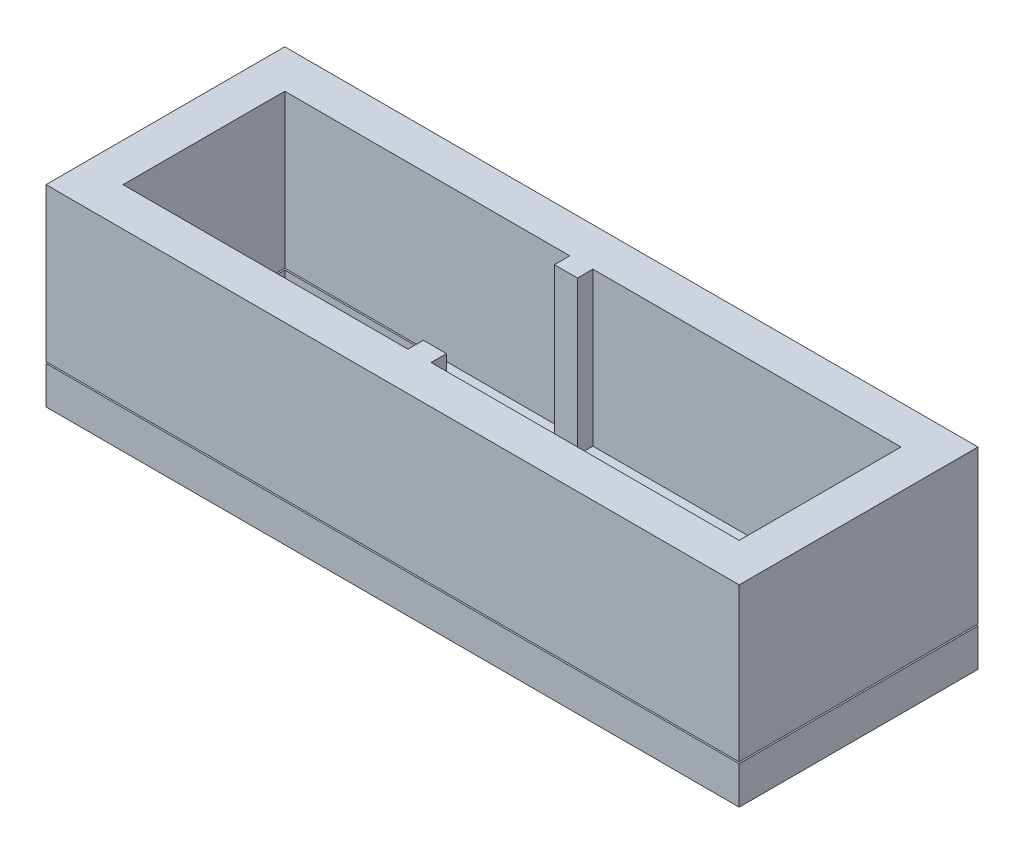
ISO-10303-21;
HEADER;
FILE_DESCRIPTION(('STEP AP214'),'2;1');
FILE_NAME('part.step','',(''),(''),'','','');
FILE_SCHEMA(('AUTOMOTIVE_DESIGN { 1 0 10303 214 1 1 1 1 }'));
ENDSEC;
DATA;
#1=APPLICATION_CONTEXT('core data for automotive mechanical design processes');
#2=APPLICATION_PROTOCOL_DEFINITION('international standard','automotive_design',2000,#1);
#3=PRODUCT_CONTEXT('',#1,'mechanical');
#4=PRODUCT('Part','Part','',(#3));
#5=PRODUCT_RELATED_PRODUCT_CATEGORY('part','',(#4));
#6=PRODUCT_DEFINITION_FORMATION('','',#4);
#7=PRODUCT_DEFINITION_CONTEXT('part definition',#1,'design');
#8=PRODUCT_DEFINITION('design','',#6,#7);
#9=PRODUCT_DEFINITION_SHAPE('','',#8);
#10=(LENGTH_UNIT() NAMED_UNIT(*) SI_UNIT(.MILLI.,.METRE.));
#11=(NAMED_UNIT(*) PLANE_ANGLE_UNIT() SI_UNIT($,.RADIAN.));
#12=(NAMED_UNIT(*) SI_UNIT($,.STERADIAN.) SOLID_ANGLE_UNIT());
#13=UNCERTAINTY_MEASURE_WITH_UNIT(LENGTH_MEASURE(1.E-05),#10,'distance_accuracy_value','');
#14=(GEOMETRIC_REPRESENTATION_CONTEXT(3) GLOBAL_UNCERTAINTY_ASSIGNED_CONTEXT((#13)) GLOBAL_UNIT_ASSIGNED_CONTEXT((#10,
#11,#12)) REPRESENTATION_CONTEXT('',''));
#15=CARTESIAN_POINT('',(0.,0.,0.));
#16=DIRECTION('',(0.,0.,1.));
#17=DIRECTION('',(1.,0.,0.));
#18=AXIS2_PLACEMENT_3D('',#15,#16,#17);
#19=CARTESIAN_POINT('',(-50.8,25.4,-13.335));
#20=DIRECTION('',(0.,0.,1.));
#21=DIRECTION('',(1.,0.,0.));
#22=AXIS2_PLACEMENT_3D('',#19,#20,#21);
#23=PLANE('',#22);
#24=DIRECTION('',(-1.,0.,0.));
#25=VECTOR('',#24,1.);
#26=CARTESIAN_POINT('',(-50.8,0.126999999999999,-13.335));
#27=LINE('',#26,#25);
#28=CARTESIAN_POINT('',(50.8,0.126999999999999,-13.335));
#29=VERTEX_POINT('',#28);
#30=CARTESIAN_POINT('',(0.,0.126999999999999,-13.335));
#31=VERTEX_POINT('',#30);
#32=EDGE_CURVE('E256',#29,#31,#27,.T.);
#33=ORIENTED_EDGE('',*,*,#32,.F.);
#34=DIRECTION('',(0.,-1.,0.));
#35=VECTOR('',#34,1.);
#36=CARTESIAN_POINT('',(50.8,25.4,-13.335));
#37=LINE('',#36,#35);
#38=CARTESIAN_POINT('',(50.8,25.4,-13.335));
#39=VERTEX_POINT('',#38);
#40=EDGE_CURVE('E301',#39,#29,#37,.T.);
#41=ORIENTED_EDGE('',*,*,#40,.F.);
#42=DIRECTION('',(-1.,0.,0.));
#43=VECTOR('',#42,1.);
#44=CARTESIAN_POINT('',(-50.8,25.4,-13.335));
#45=LINE('',#44,#43);
#46=CARTESIAN_POINT('',(0.,25.4,-13.335));
#47=VERTEX_POINT('',#46);
#48=EDGE_CURVE('E230',#39,#47,#45,.T.);
#49=ORIENTED_EDGE('',*,*,#48,.T.);
#50=DIRECTION('',(0.,-1.,0.));
#51=VECTOR('',#50,1.);
#52=CARTESIAN_POINT('',(0.,25.4,-13.335));
#53=LINE('',#52,#51);
#54=EDGE_CURVE('E205',#47,#31,#53,.T.);
#55=ORIENTED_EDGE('',*,*,#54,.T.);
#56=EDGE_LOOP('',(#33,#41,#49,#55));
#57=FACE_BOUND('',#56,.T.);
#58=ADVANCED_FACE('F57',(#57),#23,.T.);
#59=DIRECTION('',(-1.,0.,0.));
#60=VECTOR('',#59,1.);
#61=CARTESIAN_POINT('',(-50.8,0.126999999999999,-13.335));
#62=LINE('',#61,#60);
#63=CARTESIAN_POINT('',(-3.81,0.126999999999999,-13.335));
#64=VERTEX_POINT('',#63);
#65=CARTESIAN_POINT('',(-50.8,0.126999999999999,-13.335));
#66=VERTEX_POINT('',#65);
#67=EDGE_CURVE('E259',#64,#66,#62,.T.);
#68=ORIENTED_EDGE('',*,*,#67,.F.);
#69=DIRECTION('',(0.,-1.,0.));
#70=VECTOR('',#69,1.);
#71=CARTESIAN_POINT('',(-3.81,25.4,-13.335));
#72=LINE('',#71,#70);
#73=CARTESIAN_POINT('',(-3.81,25.4,-13.335));
#74=VERTEX_POINT('',#73);
#75=EDGE_CURVE('E223',#74,#64,#72,.T.);
#76=ORIENTED_EDGE('',*,*,#75,.F.);
#77=CARTESIAN_POINT('',(-50.8,25.4,-13.335));
#78=VERTEX_POINT('',#77);
#79=EDGE_CURVE('E229',#74,#78,#45,.T.);
#80=ORIENTED_EDGE('',*,*,#79,.T.);
#81=DIRECTION('',(0.,-1.,0.));
#82=VECTOR('',#81,1.);
#83=CARTESIAN_POINT('',(-50.8,25.4,-13.335));
#84=LINE('',#83,#82);
#85=EDGE_CURVE('E281',#78,#66,#84,.T.);
#86=ORIENTED_EDGE('',*,*,#85,.T.);
#87=EDGE_LOOP('',(#68,#76,#80,#86));
#88=FACE_BOUND('',#87,.T.);
#89=ADVANCED_FACE('F393',(#88),#23,.T.);
#90=CARTESIAN_POINT('',(-50.8,25.4,13.335));
#91=DIRECTION('',(0.,0.,-1.));
#92=DIRECTION('',(-1.,0.,0.));
#93=AXIS2_PLACEMENT_3D('',#90,#91,#92);
#94=PLANE('',#93);
#95=DIRECTION('',(1.,0.,0.));
#96=VECTOR('',#95,1.);
#97=CARTESIAN_POINT('',(-50.8,0.126999999999999,13.335));
#98=LINE('',#97,#96);
#99=CARTESIAN_POINT('',(0.,0.126999999999999,13.335));
#100=VERTEX_POINT('',#99);
#101=CARTESIAN_POINT('',(50.8,0.126999999999999,13.335));
#102=VERTEX_POINT('',#101);
#103=EDGE_CURVE('E247',#100,#102,#98,.T.);
#104=ORIENTED_EDGE('',*,*,#103,.F.);
#105=DIRECTION('',(0.,-1.,0.));
#106=VECTOR('',#105,1.);
#107=CARTESIAN_POINT('',(0.,25.4,13.335));
#108=LINE('',#107,#106);
#109=CARTESIAN_POINT('',(0.,25.4,13.335));
#110=VERTEX_POINT('',#109);
#111=EDGE_CURVE('E238',#110,#100,#108,.T.);
#112=ORIENTED_EDGE('',*,*,#111,.F.);
#113=DIRECTION('',(1.,0.,0.));
#114=VECTOR('',#113,1.);
#115=CARTESIAN_POINT('',(-50.8,25.4,13.335));
#116=LINE('',#115,#114);
#117=CARTESIAN_POINT('',(50.8,25.4,13.335));
#118=VERTEX_POINT('',#117);
#119=EDGE_CURVE('E284',#110,#118,#116,.T.);
#120=ORIENTED_EDGE('',*,*,#119,.T.);
#121=DIRECTION('',(0.,-1.,0.));
#122=VECTOR('',#121,1.);
#123=CARTESIAN_POINT('',(50.8,25.4,13.335));
#124=LINE('',#123,#122);
#125=EDGE_CURVE('E289',#118,#102,#124,.T.);
#126=ORIENTED_EDGE('',*,*,#125,.T.);
#127=EDGE_LOOP('',(#104,#112,#120,#126));
#128=FACE_BOUND('',#127,.T.);
#129=ADVANCED_FACE('F376',(#128),#94,.T.);
#130=DIRECTION('',(1.,0.,0.));
#131=VECTOR('',#130,1.);
#132=CARTESIAN_POINT('',(-50.8,0.126999999999999,13.335));
#133=LINE('',#132,#131);
#134=CARTESIAN_POINT('',(-50.8,0.126999999999999,13.335));
#135=VERTEX_POINT('',#134);
#136=CARTESIAN_POINT('',(-3.81,0.126999999999999,13.335));
#137=VERTEX_POINT('',#136);
#138=EDGE_CURVE('E67',#135,#137,#133,.T.);
#139=ORIENTED_EDGE('',*,*,#138,.F.);
#140=DIRECTION('',(0.,-1.,0.));
#141=VECTOR('',#140,1.);
#142=CARTESIAN_POINT('',(-50.8,25.4,13.335));
#143=LINE('',#142,#141);
#144=CARTESIAN_POINT('',(-50.8,25.4,13.335));
#145=VERTEX_POINT('',#144);
#146=EDGE_CURVE('E60',#145,#135,#143,.T.);
#147=ORIENTED_EDGE('',*,*,#146,.F.);
#148=CARTESIAN_POINT('',(-3.81,25.4,13.335));
#149=VERTEX_POINT('',#148);
#150=EDGE_CURVE('E291',#145,#149,#116,.T.);
#151=ORIENTED_EDGE('',*,*,#150,.T.);
#152=DIRECTION('',(0.,-1.,0.));
#153=VECTOR('',#152,1.);
#154=CARTESIAN_POINT('',(-3.81,25.4,13.335));
#155=LINE('',#154,#153);
#156=EDGE_CURVE('E318',#149,#137,#155,.T.);
#157=ORIENTED_EDGE('',*,*,#156,.T.);
#158=EDGE_LOOP('',(#139,#147,#151,#157));
#159=FACE_BOUND('',#158,.T.);
#160=ADVANCED_FACE('F364',(#159),#94,.T.);
#161=CARTESIAN_POINT('',(0.,25.4,0.));
#162=DIRECTION('',(0.,-1.,0.));
#163=DIRECTION('',(0.,0.,-1.));
#164=AXIS2_PLACEMENT_3D('',#161,#162,#163);
#165=PLANE('',#164);
#166=DIRECTION('',(0.,0.,-1.));
#167=VECTOR('',#166,1.);
#168=CARTESIAN_POINT('',(57.15,25.4,19.685));
#169=LINE('',#168,#167);
#170=CARTESIAN_POINT('',(57.15,25.4,19.685));
#171=VERTEX_POINT('',#170);
#172=CARTESIAN_POINT('',(57.15,25.4,-19.685));
#173=VERTEX_POINT('',#172);
#174=EDGE_CURVE('E322',#171,#173,#169,.T.);
#175=ORIENTED_EDGE('',*,*,#174,.T.);
#176=DIRECTION('',(-1.,0.,0.));
#177=VECTOR('',#176,1.);
#178=CARTESIAN_POINT('',(-57.15,25.4,-19.685));
#179=LINE('',#178,#177);
#180=CARTESIAN_POINT('',(-57.15,25.4,-19.685));
#181=VERTEX_POINT('',#180);
#182=EDGE_CURVE('E342',#173,#181,#179,.T.);
#183=ORIENTED_EDGE('',*,*,#182,.T.);
#184=DIRECTION('',(0.,0.,1.));
#185=VECTOR('',#184,1.);
#186=CARTESIAN_POINT('',(-57.15,25.4,19.685));
#187=LINE('',#186,#185);
#188=CARTESIAN_POINT('',(-57.15,25.4,19.685));
#189=VERTEX_POINT('',#188);
#190=EDGE_CURVE('E335',#181,#189,#187,.T.);
#191=ORIENTED_EDGE('',*,*,#190,.T.);
#192=DIRECTION('',(1.,0.,0.));
#193=VECTOR('',#192,1.);
#194=CARTESIAN_POINT('',(-57.15,25.4,19.685));
#195=LINE('',#194,#193);
#196=EDGE_CURVE('E332',#189,#171,#195,.T.);
#197=ORIENTED_EDGE('',*,*,#196,.T.);
#198=EDGE_LOOP('',(#175,#183,#191,#197));
#199=FACE_BOUND('',#198,.T.);
#200=DIRECTION('',(0.,0.,-1.));
#201=VECTOR('',#200,1.);
#202=CARTESIAN_POINT('',(50.8,25.4,13.335));
#203=LINE('',#202,#201);
#204=EDGE_CURVE('E233',#118,#39,#203,.T.);
#205=ORIENTED_EDGE('',*,*,#204,.F.);
#206=ORIENTED_EDGE('',*,*,#119,.F.);
#207=DIRECTION('',(0.,0.,-1.));
#208=VECTOR('',#207,1.);
#209=CARTESIAN_POINT('',(0.,25.4,13.335));
#210=LINE('',#209,#208);
#211=CARTESIAN_POINT('',(0.,25.4,10.795));
#212=VERTEX_POINT('',#211);
#213=EDGE_CURVE('E215',#110,#212,#210,.T.);
#214=ORIENTED_EDGE('',*,*,#213,.T.);
#215=DIRECTION('',(-1.,0.,0.));
#216=VECTOR('',#215,1.);
#217=CARTESIAN_POINT('',(0.,25.4,10.795));
#218=LINE('',#217,#216);
#219=CARTESIAN_POINT('',(-3.81,25.4,10.795));
#220=VERTEX_POINT('',#219);
#221=EDGE_CURVE('E328',#212,#220,#218,.T.);
#222=ORIENTED_EDGE('',*,*,#221,.T.);
#223=DIRECTION('',(0.,0.,1.));
#224=VECTOR('',#223,1.);
#225=CARTESIAN_POINT('',(-3.81,25.4,13.335));
#226=LINE('',#225,#224);
#227=EDGE_CURVE('E218',#220,#149,#226,.T.);
#228=ORIENTED_EDGE('',*,*,#227,.T.);
#229=ORIENTED_EDGE('',*,*,#150,.F.);
#230=DIRECTION('',(0.,0.,1.));
#231=VECTOR('',#230,1.);
#232=CARTESIAN_POINT('',(-50.8,25.4,13.335));
#233=LINE('',#232,#231);
#234=EDGE_CURVE('E309',#78,#145,#233,.T.);
#235=ORIENTED_EDGE('',*,*,#234,.F.);
#236=ORIENTED_EDGE('',*,*,#79,.F.);
#237=DIRECTION('',(0.,0.,1.));
#238=VECTOR('',#237,1.);
#239=CARTESIAN_POINT('',(-3.81,25.4,-13.335));
#240=LINE('',#239,#238);
#241=CARTESIAN_POINT('',(-3.81,25.4,-10.795));
#242=VERTEX_POINT('',#241);
#243=EDGE_CURVE('E190',#74,#242,#240,.T.);
#244=ORIENTED_EDGE('',*,*,#243,.T.);
#245=DIRECTION('',(1.,0.,0.));
#246=VECTOR('',#245,1.);
#247=CARTESIAN_POINT('',(0.,25.4,-10.795));
#248=LINE('',#247,#246);
#249=CARTESIAN_POINT('',(0.,25.4,-10.795));
#250=VERTEX_POINT('',#249);
#251=EDGE_CURVE('E181',#242,#250,#248,.T.);
#252=ORIENTED_EDGE('',*,*,#251,.T.);
#253=DIRECTION('',(0.,0.,-1.));
#254=VECTOR('',#253,1.);
#255=CARTESIAN_POINT('',(0.,25.4,-13.335));
#256=LINE('',#255,#254);
#257=EDGE_CURVE('E187',#250,#47,#256,.T.);
#258=ORIENTED_EDGE('',*,*,#257,.T.);
#259=ORIENTED_EDGE('',*,*,#48,.F.);
#260=EDGE_LOOP('',(#205,#206,#214,#222,#228,#229,#235,#236,#244,#252,#258,#259));
#261=FACE_BOUND('',#260,.T.);
#262=ADVANCED_FACE('F184',(#199,#261),#165,.F.);
#263=CARTESIAN_POINT('',(57.15,25.4,19.685));
#264=DIRECTION('',(-1.,0.,0.));
#265=DIRECTION('',(0.,0.,1.));
#266=AXIS2_PLACEMENT_3D('',#263,#264,#265);
#267=PLANE('',#266);
#268=DIRECTION('',(0.,-1.,0.));
#269=VECTOR('',#268,1.);
#270=CARTESIAN_POINT('',(57.15,25.4,19.685));
#271=LINE('',#270,#269);
#272=CARTESIAN_POINT('',(57.15,0.126999999999999,19.685));
#273=VERTEX_POINT('',#272);
#274=EDGE_CURVE('E207',#171,#273,#271,.T.);
#275=ORIENTED_EDGE('',*,*,#274,.T.);
#276=DIRECTION('',(0.,0.,1.));
#277=VECTOR('',#276,1.);
#278=CARTESIAN_POINT('',(57.15,0.127,-19.685));
#279=LINE('',#278,#277);
#280=CARTESIAN_POINT('',(57.15,0.127,-19.685));
#281=VERTEX_POINT('',#280);
#282=EDGE_CURVE('E13',#281,#273,#279,.T.);
#283=ORIENTED_EDGE('',*,*,#282,.F.);
#284=DIRECTION('',(0.,-1.,0.));
#285=VECTOR('',#284,1.);
#286=CARTESIAN_POINT('',(57.15,25.4,-19.685));
#287=LINE('',#286,#285);
#288=EDGE_CURVE('E211',#173,#281,#287,.T.);
#289=ORIENTED_EDGE('',*,*,#288,.F.);
#290=ORIENTED_EDGE('',*,*,#174,.F.);
#291=EDGE_LOOP('',(#275,#283,#289,#290));
#292=FACE_BOUND('',#291,.T.);
#293=ADVANCED_FACE('F420',(#292),#267,.F.);
#294=CARTESIAN_POINT('',(-57.15,25.4,-19.685));
#295=DIRECTION('',(0.,0.,1.));
#296=DIRECTION('',(1.,0.,0.));
#297=AXIS2_PLACEMENT_3D('',#294,#295,#296);
#298=PLANE('',#297);
#299=ORIENTED_EDGE('',*,*,#288,.T.);
#300=DIRECTION('',(-1.,0.,0.));
#301=VECTOR('',#300,1.);
#302=CARTESIAN_POINT('',(0.,0.127,-19.685));
#303=LINE('',#302,#301);
#304=CARTESIAN_POINT('',(-57.15,0.126999999999993,-19.685));
#305=VERTEX_POINT('',#304);
#306=EDGE_CURVE('E84',#281,#305,#303,.T.);
#307=ORIENTED_EDGE('',*,*,#306,.T.);
#308=DIRECTION('',(0.,-1.,0.));
#309=VECTOR('',#308,1.);
#310=CARTESIAN_POINT('',(-57.15,25.4,-19.685));
#311=LINE('',#310,#309);
#312=EDGE_CURVE('E269',#181,#305,#311,.T.);
#313=ORIENTED_EDGE('',*,*,#312,.F.);
#314=ORIENTED_EDGE('',*,*,#182,.F.);
#315=EDGE_LOOP('',(#299,#307,#313,#314));
#316=FACE_BOUND('',#315,.T.);
#317=ADVANCED_FACE('F416',(#316),#298,.F.);
#318=CARTESIAN_POINT('',(-57.15,25.4,19.685));
#319=DIRECTION('',(1.,0.,0.));
#320=DIRECTION('',(0.,0.,-1.));
#321=AXIS2_PLACEMENT_3D('',#318,#319,#320);
#322=PLANE('',#321);
#323=ORIENTED_EDGE('',*,*,#312,.T.);
#324=DIRECTION('',(0.,0.,1.));
#325=VECTOR('',#324,1.);
#326=CARTESIAN_POINT('',(-57.15,0.126999999999993,-19.685));
#327=LINE('',#326,#325);
#328=CARTESIAN_POINT('',(-57.15,0.126999999999993,19.685));
#329=VERTEX_POINT('',#328);
#330=EDGE_CURVE('E87',#305,#329,#327,.T.);
#331=ORIENTED_EDGE('',*,*,#330,.T.);
#332=DIRECTION('',(0.,-1.,0.));
#333=VECTOR('',#332,1.);
#334=CARTESIAN_POINT('',(-57.15,25.4,19.685));
#335=LINE('',#334,#333);
#336=EDGE_CURVE('E234',#189,#329,#335,.T.);
#337=ORIENTED_EDGE('',*,*,#336,.F.);
#338=ORIENTED_EDGE('',*,*,#190,.F.);
#339=EDGE_LOOP('',(#323,#331,#337,#338));
#340=FACE_BOUND('',#339,.T.);
#341=ADVANCED_FACE('F387',(#340),#322,.F.);
#342=CARTESIAN_POINT('',(-57.15,25.4,19.685));
#343=DIRECTION('',(0.,0.,-1.));
#344=DIRECTION('',(-1.,0.,0.));
#345=AXIS2_PLACEMENT_3D('',#342,#343,#344);
#346=PLANE('',#345);
#347=ORIENTED_EDGE('',*,*,#336,.T.);
#348=DIRECTION('',(1.,0.,0.));
#349=VECTOR('',#348,1.);
#350=CARTESIAN_POINT('',(-57.15,0.126999999999999,19.685));
#351=LINE('',#350,#349);
#352=EDGE_CURVE('E75',#329,#273,#351,.T.);
#353=ORIENTED_EDGE('',*,*,#352,.T.);
#354=ORIENTED_EDGE('',*,*,#274,.F.);
#355=ORIENTED_EDGE('',*,*,#196,.F.);
#356=EDGE_LOOP('',(#347,#353,#354,#355));
#357=FACE_BOUND('',#356,.T.);
#358=ADVANCED_FACE('F380',(#357),#346,.F.);
#359=CARTESIAN_POINT('',(50.8,25.4,13.335));
#360=DIRECTION('',(-1.,0.,0.));
#361=DIRECTION('',(0.,0.,1.));
#362=AXIS2_PLACEMENT_3D('',#359,#360,#361);
#363=PLANE('',#362);
#364=DIRECTION('',(0.,0.,-1.));
#365=VECTOR('',#364,1.);
#366=CARTESIAN_POINT('',(50.8,0.126999999999999,13.335));
#367=LINE('',#366,#365);
#368=EDGE_CURVE('E250',#102,#29,#367,.T.);
#369=ORIENTED_EDGE('',*,*,#368,.F.);
#370=ORIENTED_EDGE('',*,*,#125,.F.);
#371=ORIENTED_EDGE('',*,*,#204,.T.);
#372=ORIENTED_EDGE('',*,*,#40,.T.);
#373=EDGE_LOOP('',(#369,#370,#371,#372));
#374=FACE_BOUND('',#373,.T.);
#375=ADVANCED_FACE('F378',(#374),#363,.T.);
#376=CARTESIAN_POINT('',(-50.8,25.4,13.335));
#377=DIRECTION('',(1.,0.,0.));
#378=DIRECTION('',(0.,0.,-1.));
#379=AXIS2_PLACEMENT_3D('',#376,#377,#378);
#380=PLANE('',#379);
#381=DIRECTION('',(0.,0.,1.));
#382=VECTOR('',#381,1.);
#383=CARTESIAN_POINT('',(-50.8,0.126999999999999,13.335));
#384=LINE('',#383,#382);
#385=EDGE_CURVE('E253',#66,#135,#384,.T.);
#386=ORIENTED_EDGE('',*,*,#385,.F.);
#387=ORIENTED_EDGE('',*,*,#85,.F.);
#388=ORIENTED_EDGE('',*,*,#234,.T.);
#389=ORIENTED_EDGE('',*,*,#146,.T.);
#390=EDGE_LOOP('',(#386,#387,#388,#389));
#391=FACE_BOUND('',#390,.T.);
#392=ADVANCED_FACE('F361',(#391),#380,.T.);
#393=CARTESIAN_POINT('',(0.,25.4,13.335));
#394=DIRECTION('',(-1.,0.,0.));
#395=DIRECTION('',(0.,0.,1.));
#396=AXIS2_PLACEMENT_3D('',#393,#394,#395);
#397=PLANE('',#396);
#398=ORIENTED_EDGE('',*,*,#111,.T.);
#399=DIRECTION('',(0.,0.,-1.));
#400=VECTOR('',#399,1.);
#401=CARTESIAN_POINT('',(0.,0.126999999999999,13.335));
#402=LINE('',#401,#400);
#403=CARTESIAN_POINT('',(0.,0.126999999999999,10.795));
#404=VERTEX_POINT('',#403);
#405=EDGE_CURVE('E95',#100,#404,#402,.T.);
#406=ORIENTED_EDGE('',*,*,#405,.T.);
#407=DIRECTION('',(0.,-1.,0.));
#408=VECTOR('',#407,1.);
#409=CARTESIAN_POINT('',(0.,25.4,10.795));
#410=LINE('',#409,#408);
#411=EDGE_CURVE('E237',#212,#404,#410,.T.);
#412=ORIENTED_EDGE('',*,*,#411,.F.);
#413=ORIENTED_EDGE('',*,*,#213,.F.);
#414=EDGE_LOOP('',(#398,#406,#412,#413));
#415=FACE_BOUND('',#414,.T.);
#416=ADVANCED_FACE('F374',(#415),#397,.F.);
#417=CARTESIAN_POINT('',(0.,25.4,10.795));
#418=DIRECTION('',(0.,0.,1.));
#419=DIRECTION('',(1.,0.,0.));
#420=AXIS2_PLACEMENT_3D('',#417,#418,#419);
#421=PLANE('',#420);
#422=ORIENTED_EDGE('',*,*,#411,.T.);
#423=DIRECTION('',(-1.,0.,0.));
#424=VECTOR('',#423,1.);
#425=CARTESIAN_POINT('',(0.,0.126999999999999,10.795));
#426=LINE('',#425,#424);
#427=CARTESIAN_POINT('',(-3.81,0.126999999999999,10.795));
#428=VERTEX_POINT('',#427);
#429=EDGE_CURVE('E239',#404,#428,#426,.T.);
#430=ORIENTED_EDGE('',*,*,#429,.T.);
#431=DIRECTION('',(0.,-1.,0.));
#432=VECTOR('',#431,1.);
#433=CARTESIAN_POINT('',(-3.81,25.4,10.795));
#434=LINE('',#433,#432);
#435=EDGE_CURVE('E243',#220,#428,#434,.T.);
#436=ORIENTED_EDGE('',*,*,#435,.F.);
#437=ORIENTED_EDGE('',*,*,#221,.F.);
#438=EDGE_LOOP('',(#422,#430,#436,#437));
#439=FACE_BOUND('',#438,.T.);
#440=ADVANCED_FACE('F372',(#439),#421,.F.);
#441=CARTESIAN_POINT('',(-3.81,25.4,13.335));
#442=DIRECTION('',(1.,0.,0.));
#443=DIRECTION('',(0.,0.,-1.));
#444=AXIS2_PLACEMENT_3D('',#441,#442,#443);
#445=PLANE('',#444);
#446=ORIENTED_EDGE('',*,*,#435,.T.);
#447=DIRECTION('',(0.,0.,1.));
#448=VECTOR('',#447,1.);
#449=CARTESIAN_POINT('',(-3.81,0.126999999999999,13.335));
#450=LINE('',#449,#448);
#451=EDGE_CURVE('E201',#428,#137,#450,.T.);
#452=ORIENTED_EDGE('',*,*,#451,.T.);
#453=ORIENTED_EDGE('',*,*,#156,.F.);
#454=ORIENTED_EDGE('',*,*,#227,.F.);
#455=EDGE_LOOP('',(#446,#452,#453,#454));
#456=FACE_BOUND('',#455,.T.);
#457=ADVANCED_FACE('F369',(#456),#445,.F.);
#458=CARTESIAN_POINT('',(0.,25.4,-13.335));
#459=DIRECTION('',(-1.,0.,0.));
#460=DIRECTION('',(0.,0.,1.));
#461=AXIS2_PLACEMENT_3D('',#458,#459,#460);
#462=PLANE('',#461);
#463=DIRECTION('',(0.,-1.,0.));
#464=VECTOR('',#463,1.);
#465=CARTESIAN_POINT('',(0.,25.4,-10.795));
#466=LINE('',#465,#464);
#467=CARTESIAN_POINT('',(0.,0.126999999999999,-10.795));
#468=VERTEX_POINT('',#467);
#469=EDGE_CURVE('E197',#250,#468,#466,.T.);
#470=ORIENTED_EDGE('',*,*,#469,.T.);
#471=DIRECTION('',(0.,0.,-1.));
#472=VECTOR('',#471,1.);
#473=CARTESIAN_POINT('',(0.,0.126999999999999,-13.335));
#474=LINE('',#473,#472);
#475=EDGE_CURVE('E130',#468,#31,#474,.T.);
#476=ORIENTED_EDGE('',*,*,#475,.T.);
#477=ORIENTED_EDGE('',*,*,#54,.F.);
#478=ORIENTED_EDGE('',*,*,#257,.F.);
#479=EDGE_LOOP('',(#470,#476,#477,#478));
#480=FACE_BOUND('',#479,.T.);
#481=ADVANCED_FACE('F203',(#480),#462,.F.);
#482=CARTESIAN_POINT('',(-3.81,25.4,-13.335));
#483=DIRECTION('',(1.,0.,0.));
#484=DIRECTION('',(0.,0.,-1.));
#485=AXIS2_PLACEMENT_3D('',#482,#483,#484);
#486=PLANE('',#485);
#487=ORIENTED_EDGE('',*,*,#75,.T.);
#488=DIRECTION('',(0.,0.,1.));
#489=VECTOR('',#488,1.);
#490=CARTESIAN_POINT('',(-3.81,0.126999999999999,-13.335));
#491=LINE('',#490,#489);
#492=CARTESIAN_POINT('',(-3.81,0.126999999999999,-10.795));
#493=VERTEX_POINT('',#492);
#494=EDGE_CURVE('E123',#64,#493,#491,.T.);
#495=ORIENTED_EDGE('',*,*,#494,.T.);
#496=DIRECTION('',(0.,-1.,0.));
#497=VECTOR('',#496,1.);
#498=CARTESIAN_POINT('',(-3.81,25.4,-10.795));
#499=LINE('',#498,#497);
#500=EDGE_CURVE('E220',#242,#493,#499,.T.);
#501=ORIENTED_EDGE('',*,*,#500,.F.);
#502=ORIENTED_EDGE('',*,*,#243,.F.);
#503=EDGE_LOOP('',(#487,#495,#501,#502));
#504=FACE_BOUND('',#503,.T.);
#505=ADVANCED_FACE('F401',(#504),#486,.F.);
#506=CARTESIAN_POINT('',(0.,25.4,-10.795));
#507=DIRECTION('',(0.,0.,-1.));
#508=DIRECTION('',(-1.,0.,0.));
#509=AXIS2_PLACEMENT_3D('',#506,#507,#508);
#510=PLANE('',#509);
#511=ORIENTED_EDGE('',*,*,#500,.T.);
#512=DIRECTION('',(1.,0.,0.));
#513=VECTOR('',#512,1.);
#514=CARTESIAN_POINT('',(0.,0.126999999999999,-10.795));
#515=LINE('',#514,#513);
#516=EDGE_CURVE('E127',#493,#468,#515,.T.);
#517=ORIENTED_EDGE('',*,*,#516,.T.);
#518=ORIENTED_EDGE('',*,*,#469,.F.);
#519=ORIENTED_EDGE('',*,*,#251,.F.);
#520=EDGE_LOOP('',(#511,#517,#518,#519));
#521=FACE_BOUND('',#520,.T.);
#522=ADVANCED_FACE('F198',(#521),#510,.F.);
#523=CARTESIAN_POINT('',(0.,0.127,-19.685));
#524=DIRECTION('',(0.,1.,0.));
#525=DIRECTION('',(0.,0.,1.));
#526=AXIS2_PLACEMENT_3D('',#523,#524,#525);
#527=PLANE('',#526);
#528=ORIENTED_EDGE('',*,*,#103,.T.);
#529=ORIENTED_EDGE('',*,*,#368,.T.);
#530=ORIENTED_EDGE('',*,*,#32,.T.);
#531=ORIENTED_EDGE('',*,*,#475,.F.);
#532=ORIENTED_EDGE('',*,*,#516,.F.);
#533=ORIENTED_EDGE('',*,*,#494,.F.);
#534=ORIENTED_EDGE('',*,*,#67,.T.);
#535=ORIENTED_EDGE('',*,*,#385,.T.);
#536=ORIENTED_EDGE('',*,*,#138,.T.);
#537=ORIENTED_EDGE('',*,*,#451,.F.);
#538=ORIENTED_EDGE('',*,*,#429,.F.);
#539=ORIENTED_EDGE('',*,*,#405,.F.);
#540=EDGE_LOOP('',(#528,#529,#530,#531,#532,#533,#534,#535,#536,#537,#538,#539));
#541=FACE_BOUND('',#540,.T.);
#542=ORIENTED_EDGE('',*,*,#330,.F.);
#543=ORIENTED_EDGE('',*,*,#306,.F.);
#544=ORIENTED_EDGE('',*,*,#282,.T.);
#545=ORIENTED_EDGE('',*,*,#352,.F.);
#546=EDGE_LOOP('',(#542,#543,#544,#545));
#547=FACE_BOUND('',#546,.T.);
#548=ADVANCED_FACE('F367',(#541,#547),#527,.F.);
#549=CLOSED_SHELL('',(#58,#89,#129,#160,#262,#293,#317,#341,#358,#375,#392,#416,#440,#457,#481,
#505,#522,#548));
#550=MANIFOLD_SOLID_BREP('B2',#549);
#551=CARTESIAN_POINT('',(-57.15,25.4,19.685));
#552=DIRECTION('',(0.,0.,-1.));
#553=DIRECTION('',(-1.,0.,0.));
#554=AXIS2_PLACEMENT_3D('',#551,#552,#553);
#555=PLANE('',#554);
#556=DIRECTION('',(1.,0.,0.));
#557=VECTOR('',#556,1.);
#558=CARTESIAN_POINT('',(-57.15,-0.126999999999999,19.685));
#559=LINE('',#558,#557);
#560=CARTESIAN_POINT('',(-57.15,-0.127000000000006,19.685));
#561=VERTEX_POINT('',#560);
#562=CARTESIAN_POINT('',(57.15,-0.127,19.685));
#563=VERTEX_POINT('',#562);
#564=EDGE_CURVE('E692',#561,#563,#559,.T.);
#565=ORIENTED_EDGE('',*,*,#564,.F.);
#566=DIRECTION('',(0.,-1.,0.));
#567=VECTOR('',#566,1.);
#568=CARTESIAN_POINT('',(-57.15,25.4,19.685));
#569=LINE('',#568,#567);
#570=CARTESIAN_POINT('',(-57.15,-6.35,19.685));
#571=VERTEX_POINT('',#570);
#572=EDGE_CURVE('E645',#561,#571,#569,.T.);
#573=ORIENTED_EDGE('',*,*,#572,.T.);
#574=DIRECTION('',(-1.,0.,0.));
#575=VECTOR('',#574,1.);
#576=CARTESIAN_POINT('',(57.15,-6.35,19.685));
#577=LINE('',#576,#575);
#578=CARTESIAN_POINT('',(57.15,-6.35,19.685));
#579=VERTEX_POINT('',#578);
#580=EDGE_CURVE('E699',#579,#571,#577,.T.);
#581=ORIENTED_EDGE('',*,*,#580,.F.);
#582=DIRECTION('',(0.,-1.,0.));
#583=VECTOR('',#582,1.);
#584=CARTESIAN_POINT('',(57.15,25.4,19.685));
#585=LINE('',#584,#583);
#586=EDGE_CURVE('E655',#563,#579,#585,.T.);
#587=ORIENTED_EDGE('',*,*,#586,.F.);
#588=EDGE_LOOP('',(#565,#573,#581,#587));
#589=FACE_BOUND('',#588,.T.);
#590=ADVANCED_FACE('F569',(#589),#555,.F.);
#591=CARTESIAN_POINT('',(-57.15,25.4,19.685));
#592=DIRECTION('',(1.,0.,0.));
#593=DIRECTION('',(0.,0.,-1.));
#594=AXIS2_PLACEMENT_3D('',#591,#592,#593);
#595=PLANE('',#594);
#596=DIRECTION('',(0.,0.,1.));
#597=VECTOR('',#596,1.);
#598=CARTESIAN_POINT('',(-57.15,-0.127000000000007,-19.685));
#599=LINE('',#598,#597);
#600=CARTESIAN_POINT('',(-57.15,-0.127000000000007,-19.685));
#601=VERTEX_POINT('',#600);
#602=EDGE_CURVE('E584',#601,#561,#599,.T.);
#603=ORIENTED_EDGE('',*,*,#602,.F.);
#604=DIRECTION('',(0.,-1.,0.));
#605=VECTOR('',#604,1.);
#606=CARTESIAN_POINT('',(-57.15,25.4,-19.685));
#607=LINE('',#606,#605);
#608=CARTESIAN_POINT('',(-57.15,-6.35,-19.685));
#609=VERTEX_POINT('',#608);
#610=EDGE_CURVE('E643',#601,#609,#607,.T.);
#611=ORIENTED_EDGE('',*,*,#610,.T.);
#612=DIRECTION('',(0.,0.,-1.));
#613=VECTOR('',#612,1.);
#614=CARTESIAN_POINT('',(-57.15,-6.35,19.685));
#615=LINE('',#614,#613);
#616=EDGE_CURVE('E702',#571,#609,#615,.T.);
#617=ORIENTED_EDGE('',*,*,#616,.F.);
#618=ORIENTED_EDGE('',*,*,#572,.F.);
#619=EDGE_LOOP('',(#603,#611,#617,#618));
#620=FACE_BOUND('',#619,.T.);
#621=ADVANCED_FACE('F641',(#620),#595,.F.);
#622=CARTESIAN_POINT('',(-57.15,25.4,-19.685));
#623=DIRECTION('',(0.,0.,1.));
#624=DIRECTION('',(1.,0.,0.));
#625=AXIS2_PLACEMENT_3D('',#622,#623,#624);
#626=PLANE('',#625);
#627=DIRECTION('',(-1.,0.,0.));
#628=VECTOR('',#627,1.);
#629=CARTESIAN_POINT('',(0.,-0.127,-19.685));
#630=LINE('',#629,#628);
#631=CARTESIAN_POINT('',(57.15,-0.127,-19.685));
#632=VERTEX_POINT('',#631);
#633=EDGE_CURVE('E631',#632,#601,#630,.T.);
#634=ORIENTED_EDGE('',*,*,#633,.F.);
#635=DIRECTION('',(0.,-1.,0.));
#636=VECTOR('',#635,1.);
#637=CARTESIAN_POINT('',(57.15,25.4,-19.685));
#638=LINE('',#637,#636);
#639=CARTESIAN_POINT('',(57.15,-6.35,-19.685));
#640=VERTEX_POINT('',#639);
#641=EDGE_CURVE('E651',#632,#640,#638,.T.);
#642=ORIENTED_EDGE('',*,*,#641,.T.);
#643=DIRECTION('',(1.,0.,0.));
#644=VECTOR('',#643,1.);
#645=CARTESIAN_POINT('',(-57.15,-6.35,-19.685));
#646=LINE('',#645,#644);
#647=EDGE_CURVE('E650',#609,#640,#646,.T.);
#648=ORIENTED_EDGE('',*,*,#647,.F.);
#649=ORIENTED_EDGE('',*,*,#610,.F.);
#650=EDGE_LOOP('',(#634,#642,#648,#649));
#651=FACE_BOUND('',#650,.T.);
#652=ADVANCED_FACE('F648',(#651),#626,.F.);
#653=CARTESIAN_POINT('',(57.15,25.4,19.685));
#654=DIRECTION('',(-1.,0.,0.));
#655=DIRECTION('',(0.,0.,1.));
#656=AXIS2_PLACEMENT_3D('',#653,#654,#655);
#657=PLANE('',#656);
#658=DIRECTION('',(0.,0.,1.));
#659=VECTOR('',#658,1.);
#660=CARTESIAN_POINT('',(57.15,-0.127,-19.685));
#661=LINE('',#660,#659);
#662=EDGE_CURVE('E634',#632,#563,#661,.T.);
#663=ORIENTED_EDGE('',*,*,#662,.T.);
#664=ORIENTED_EDGE('',*,*,#586,.T.);
#665=DIRECTION('',(0.,0.,1.));
#666=VECTOR('',#665,1.);
#667=CARTESIAN_POINT('',(57.15,-6.35,-19.685));
#668=LINE('',#667,#666);
#669=EDGE_CURVE('E690',#640,#579,#668,.T.);
#670=ORIENTED_EDGE('',*,*,#669,.F.);
#671=ORIENTED_EDGE('',*,*,#641,.F.);
#672=EDGE_LOOP('',(#663,#664,#670,#671));
#673=FACE_BOUND('',#672,.T.);
#674=ADVANCED_FACE('F571',(#673),#657,.F.);
#675=CARTESIAN_POINT('',(0.,-6.35,0.));
#676=DIRECTION('',(0.,-1.,0.));
#677=DIRECTION('',(0.,0.,-1.));
#678=AXIS2_PLACEMENT_3D('',#675,#676,#677);
#679=PLANE('',#678);
#680=DIRECTION('',(0.,0.,-1.));
#681=VECTOR('',#680,1.);
#682=CARTESIAN_POINT('',(-50.8,-6.35,0.));
#683=LINE('',#682,#681);
#684=CARTESIAN_POINT('',(-50.8,-6.35,13.335));
#685=VERTEX_POINT('',#684);
#686=CARTESIAN_POINT('',(-50.8,-6.35,-13.335));
#687=VERTEX_POINT('',#686);
#688=EDGE_CURVE('E577',#685,#687,#683,.T.);
#689=ORIENTED_EDGE('',*,*,#688,.F.);
#690=DIRECTION('',(-1.,0.,0.));
#691=VECTOR('',#690,1.);
#692=CARTESIAN_POINT('',(0.,-6.35,13.335));
#693=LINE('',#692,#691);
#694=CARTESIAN_POINT('',(-24.13,-6.35,13.335));
#695=VERTEX_POINT('',#694);
#696=EDGE_CURVE('E653',#695,#685,#693,.T.);
#697=ORIENTED_EDGE('',*,*,#696,.F.);
#698=DIRECTION('',(0.,0.,1.));
#699=VECTOR('',#698,1.);
#700=CARTESIAN_POINT('',(-24.13,-6.35,0.));
#701=LINE('',#700,#699);
#702=CARTESIAN_POINT('',(-24.13,-6.35,-13.335));
#703=VERTEX_POINT('',#702);
#704=EDGE_CURVE('E661',#703,#695,#701,.T.);
#705=ORIENTED_EDGE('',*,*,#704,.F.);
#706=DIRECTION('',(1.,0.,0.));
#707=VECTOR('',#706,1.);
#708=CARTESIAN_POINT('',(0.,-6.35,-13.335));
#709=LINE('',#708,#707);
#710=EDGE_CURVE('E664',#687,#703,#709,.T.);
#711=ORIENTED_EDGE('',*,*,#710,.F.);
#712=EDGE_LOOP('',(#689,#697,#705,#711));
#713=FACE_BOUND('',#712,.T.);
#714=ORIENTED_EDGE('',*,*,#647,.T.);
#715=ORIENTED_EDGE('',*,*,#669,.T.);
#716=ORIENTED_EDGE('',*,*,#580,.T.);
#717=ORIENTED_EDGE('',*,*,#616,.T.);
#718=EDGE_LOOP('',(#714,#715,#716,#717));
#719=FACE_BOUND('',#718,.T.);
#720=ADVANCED_FACE('F678',(#713,#719),#679,.T.);
#721=CARTESIAN_POINT('',(-24.13,-19.05,-13.335));
#722=DIRECTION('',(1.,0.,0.));
#723=DIRECTION('',(0.,0.,-1.));
#724=AXIS2_PLACEMENT_3D('',#721,#722,#723);
#725=PLANE('',#724);
#726=DIRECTION('',(0.,0.,1.));
#727=VECTOR('',#726,1.);
#728=CARTESIAN_POINT('',(-24.13,-0.126999999999999,-13.335));
#729=LINE('',#728,#727);
#730=CARTESIAN_POINT('',(-24.13,-0.127000000000006,-13.335));
#731=VERTEX_POINT('',#730);
#732=CARTESIAN_POINT('',(-24.13,-0.126999999999999,13.335));
#733=VERTEX_POINT('',#732);
#734=EDGE_CURVE('E55',#731,#733,#729,.T.);
#735=ORIENTED_EDGE('',*,*,#734,.F.);
#736=DIRECTION('',(0.,1.,0.));
#737=VECTOR('',#736,1.);
#738=CARTESIAN_POINT('',(-24.13,-19.05,-13.335));
#739=LINE('',#738,#737);
#740=EDGE_CURVE('E684',#703,#731,#739,.T.);
#741=ORIENTED_EDGE('',*,*,#740,.F.);
#742=ORIENTED_EDGE('',*,*,#704,.T.);
#743=DIRECTION('',(0.,1.,0.));
#744=VECTOR('',#743,1.);
#745=CARTESIAN_POINT('',(-24.13,-19.05,13.335));
#746=LINE('',#745,#744);
#747=EDGE_CURVE('E688',#695,#733,#746,.T.);
#748=ORIENTED_EDGE('',*,*,#747,.T.);
#749=EDGE_LOOP('',(#735,#741,#742,#748));
#750=FACE_BOUND('',#749,.T.);
#751=ADVANCED_FACE('F686',(#750),#725,.F.);
#752=CARTESIAN_POINT('',(-50.8,25.4,13.335));
#753=DIRECTION('',(1.,0.,0.));
#754=DIRECTION('',(0.,0.,-1.));
#755=AXIS2_PLACEMENT_3D('',#752,#753,#754);
#756=PLANE('',#755);
#757=DIRECTION('',(0.,-1.,0.));
#758=VECTOR('',#757,1.);
#759=CARTESIAN_POINT('',(-50.8,25.4,-13.335));
#760=LINE('',#759,#758);
#761=CARTESIAN_POINT('',(-50.8,-0.126999999999999,-13.335));
#762=VERTEX_POINT('',#761);
#763=EDGE_CURVE('E672',#762,#687,#760,.T.);
#764=ORIENTED_EDGE('',*,*,#763,.F.);
#765=DIRECTION('',(0.,0.,1.));
#766=VECTOR('',#765,1.);
#767=CARTESIAN_POINT('',(-50.8,-0.126999999999999,13.335));
#768=LINE('',#767,#766);
#769=CARTESIAN_POINT('',(-50.8,-0.126999999999999,13.335));
#770=VERTEX_POINT('',#769);
#771=EDGE_CURVE('E710',#762,#770,#768,.T.);
#772=ORIENTED_EDGE('',*,*,#771,.T.);
#773=DIRECTION('',(0.,-1.,0.));
#774=VECTOR('',#773,1.);
#775=CARTESIAN_POINT('',(-50.8,25.4,13.335));
#776=LINE('',#775,#774);
#777=EDGE_CURVE('E674',#770,#685,#776,.T.);
#778=ORIENTED_EDGE('',*,*,#777,.T.);
#779=ORIENTED_EDGE('',*,*,#688,.T.);
#780=EDGE_LOOP('',(#764,#772,#778,#779));
#781=FACE_BOUND('',#780,.T.);
#782=ADVANCED_FACE('F670',(#781),#756,.T.);
#783=CARTESIAN_POINT('',(-50.8,25.4,13.335));
#784=DIRECTION('',(0.,0.,-1.));
#785=DIRECTION('',(-1.,0.,0.));
#786=AXIS2_PLACEMENT_3D('',#783,#784,#785);
#787=PLANE('',#786);
#788=ORIENTED_EDGE('',*,*,#777,.F.);
#789=DIRECTION('',(1.,0.,0.));
#790=VECTOR('',#789,1.);
#791=CARTESIAN_POINT('',(-50.8,-0.126999999999999,13.335));
#792=LINE('',#791,#790);
#793=EDGE_CURVE('E711',#770,#733,#792,.T.);
#794=ORIENTED_EDGE('',*,*,#793,.T.);
#795=ORIENTED_EDGE('',*,*,#747,.F.);
#796=ORIENTED_EDGE('',*,*,#696,.T.);
#797=EDGE_LOOP('',(#788,#794,#795,#796));
#798=FACE_BOUND('',#797,.T.);
#799=ADVANCED_FACE('F717',(#798),#787,.T.);
#800=CARTESIAN_POINT('',(-50.8,25.4,-13.335));
#801=DIRECTION('',(0.,0.,1.));
#802=DIRECTION('',(1.,0.,0.));
#803=AXIS2_PLACEMENT_3D('',#800,#801,#802);
#804=PLANE('',#803);
#805=ORIENTED_EDGE('',*,*,#740,.T.);
#806=DIRECTION('',(-1.,0.,0.));
#807=VECTOR('',#806,1.);
#808=CARTESIAN_POINT('',(-50.8,-0.126999999999999,-13.335));
#809=LINE('',#808,#807);
#810=EDGE_CURVE('E591',#731,#762,#809,.T.);
#811=ORIENTED_EDGE('',*,*,#810,.T.);
#812=ORIENTED_EDGE('',*,*,#763,.T.);
#813=ORIENTED_EDGE('',*,*,#710,.T.);
#814=EDGE_LOOP('',(#805,#811,#812,#813));
#815=FACE_BOUND('',#814,.T.);
#816=ADVANCED_FACE('F683',(#815),#804,.T.);
#817=CARTESIAN_POINT('',(0.,-0.127,-19.685));
#818=DIRECTION('',(0.,1.,0.));
#819=DIRECTION('',(0.,0.,1.));
#820=AXIS2_PLACEMENT_3D('',#817,#818,#819);
#821=PLANE('',#820);
#822=ORIENTED_EDGE('',*,*,#810,.F.);
#823=ORIENTED_EDGE('',*,*,#734,.T.);
#824=ORIENTED_EDGE('',*,*,#793,.F.);
#825=ORIENTED_EDGE('',*,*,#771,.F.);
#826=EDGE_LOOP('',(#822,#823,#824,#825));
#827=FACE_BOUND('',#826,.T.);
#828=ORIENTED_EDGE('',*,*,#564,.T.);
#829=ORIENTED_EDGE('',*,*,#662,.F.);
#830=ORIENTED_EDGE('',*,*,#633,.T.);
#831=ORIENTED_EDGE('',*,*,#602,.T.);
#832=EDGE_LOOP('',(#828,#829,#830,#831));
#833=FACE_BOUND('',#832,.T.);
#834=ADVANCED_FACE('F632',(#827,#833),#821,.T.);
#835=CLOSED_SHELL('',(#590,#621,#652,#674,#720,#751,#782,#799,#816,#834));
#836=MANIFOLD_SOLID_BREP('B7',#835);
#837=ADVANCED_BREP_SHAPE_REPRESENTATION('',(#18,#550,#836),#14);
#838=SHAPE_DEFINITION_REPRESENTATION(#9,#837);
ENDSEC;
END-ISO-10303-21;
